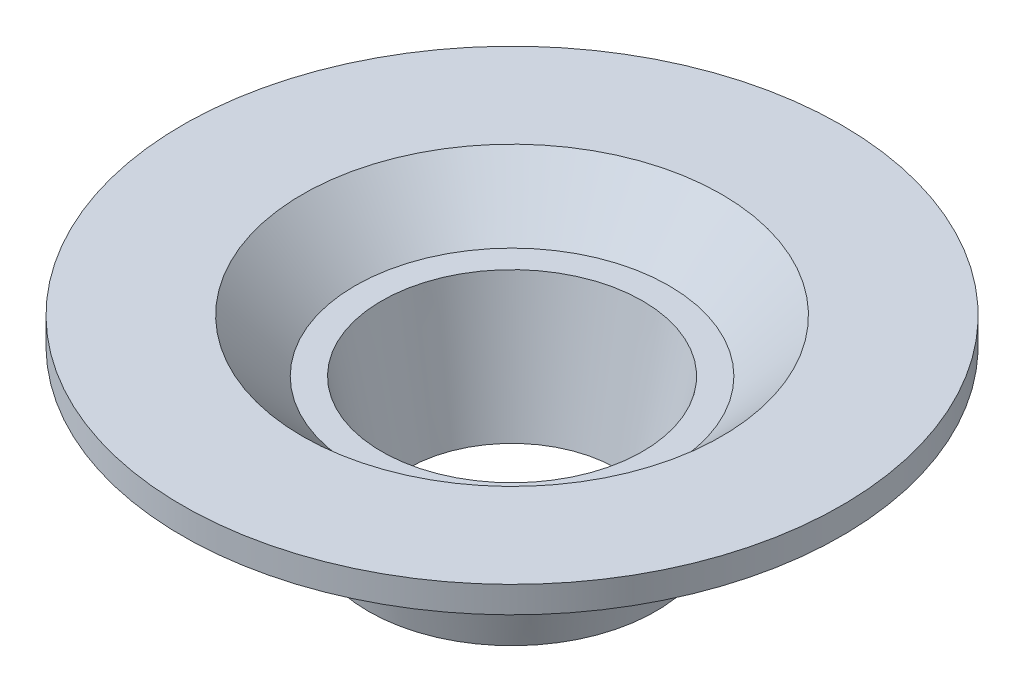
ISO-10303-21;
HEADER;
FILE_DESCRIPTION(('STEP AP214'),'2;1');
FILE_NAME('part.step','',(''),(''),'','','');
FILE_SCHEMA(('AUTOMOTIVE_DESIGN { 1 0 10303 214 1 1 1 1 }'));
ENDSEC;
DATA;
#1=APPLICATION_CONTEXT('core data for automotive mechanical design processes');
#2=APPLICATION_PROTOCOL_DEFINITION('international standard','automotive_design',2000,#1);
#3=PRODUCT_CONTEXT('',#1,'mechanical');
#4=PRODUCT('Part','Part','',(#3));
#5=PRODUCT_RELATED_PRODUCT_CATEGORY('part','',(#4));
#6=PRODUCT_DEFINITION_FORMATION('','',#4);
#7=PRODUCT_DEFINITION_CONTEXT('part definition',#1,'design');
#8=PRODUCT_DEFINITION('design','',#6,#7);
#9=PRODUCT_DEFINITION_SHAPE('','',#8);
#10=(LENGTH_UNIT() NAMED_UNIT(*) SI_UNIT(.MILLI.,.METRE.));
#11=(NAMED_UNIT(*) PLANE_ANGLE_UNIT() SI_UNIT($,.RADIAN.));
#12=(NAMED_UNIT(*) SI_UNIT($,.STERADIAN.) SOLID_ANGLE_UNIT());
#13=UNCERTAINTY_MEASURE_WITH_UNIT(LENGTH_MEASURE(1.E-05),#10,'distance_accuracy_value','');
#14=(GEOMETRIC_REPRESENTATION_CONTEXT(3) GLOBAL_UNCERTAINTY_ASSIGNED_CONTEXT((#13)) GLOBAL_UNIT_ASSIGNED_CONTEXT((#10,
#11,#12)) REPRESENTATION_CONTEXT('',''));
#15=CARTESIAN_POINT('',(0.,0.,0.));
#16=DIRECTION('',(0.,0.,1.));
#17=DIRECTION('',(1.,0.,0.));
#18=AXIS2_PLACEMENT_3D('',#15,#16,#17);
#19=CARTESIAN_POINT('',(0.,5.,0.));
#20=DIRECTION('',(0.,1.,0.));
#21=DIRECTION('',(0.,0.,1.));
#22=AXIS2_PLACEMENT_3D('',#19,#20,#21);
#23=CONICAL_SURFACE('',#22,4.95,0.197395559849881);
#24=CARTESIAN_POINT('',(0.,0.,0.));
#25=DIRECTION('',(0.,-1.,0.));
#26=DIRECTION('',(0.,0.,-1.));
#27=AXIS2_PLACEMENT_3D('',#24,#25,#26);
#28=CIRCLE('',#27,3.95);
#29=CARTESIAN_POINT('',(0.,0.,-3.95));
#30=VERTEX_POINT('',#29);
#31=EDGE_CURVE('E71',#30,#30,#28,.T.);
#32=ORIENTED_EDGE('',*,*,#31,.T.);
#33=EDGE_LOOP('',(#32));
#34=FACE_BOUND('',#33,.T.);
#35=CARTESIAN_POINT('',(0.,5.,0.));
#36=DIRECTION('',(0.,-1.,0.));
#37=DIRECTION('',(0.,0.,-1.));
#38=AXIS2_PLACEMENT_3D('',#35,#36,#37);
#39=CIRCLE('',#38,4.95);
#40=CARTESIAN_POINT('',(0.,5.,-4.95));
#41=VERTEX_POINT('',#40);
#42=EDGE_CURVE('E10',#41,#41,#39,.T.);
#43=ORIENTED_EDGE('',*,*,#42,.F.);
#44=EDGE_LOOP('',(#43));
#45=FACE_BOUND('',#44,.T.);
#46=ADVANCED_FACE('F40',(#34,#45),#23,.F.);
#47=CARTESIAN_POINT('',(4.95,5.,0.));
#48=DIRECTION('',(0.,1.,0.));
#49=DIRECTION('',(0.,0.,1.));
#50=AXIS2_PLACEMENT_3D('',#47,#48,#49);
#51=PLANE('',#50);
#52=ORIENTED_EDGE('',*,*,#42,.T.);
#53=EDGE_LOOP('',(#52));
#54=FACE_BOUND('',#53,.T.);
#55=CARTESIAN_POINT('',(0.,5.,0.));
#56=DIRECTION('',(0.,-1.,0.));
#57=DIRECTION('',(0.,0.,-1.));
#58=AXIS2_PLACEMENT_3D('',#55,#56,#57);
#59=CIRCLE('',#58,5.95);
#60=CARTESIAN_POINT('',(0.,5.,-5.95));
#61=VERTEX_POINT('',#60);
#62=EDGE_CURVE('E43',#61,#61,#59,.T.);
#63=ORIENTED_EDGE('',*,*,#62,.F.);
#64=EDGE_LOOP('',(#63));
#65=FACE_BOUND('',#64,.T.);
#66=ADVANCED_FACE('F87',(#54,#65),#51,.T.);
#67=CARTESIAN_POINT('',(0.,7.,0.));
#68=DIRECTION('',(0.,1.,0.));
#69=DIRECTION('',(0.,0.,1.));
#70=AXIS2_PLACEMENT_3D('',#67,#68,#69);
#71=CONICAL_SURFACE('',#70,7.95,0.785398163397448);
#72=ORIENTED_EDGE('',*,*,#62,.T.);
#73=EDGE_LOOP('',(#72));
#74=FACE_BOUND('',#73,.T.);
#75=CARTESIAN_POINT('',(0.,7.,0.));
#76=DIRECTION('',(0.,-1.,0.));
#77=DIRECTION('',(0.,0.,-1.));
#78=AXIS2_PLACEMENT_3D('',#75,#76,#77);
#79=CIRCLE('',#78,7.95);
#80=CARTESIAN_POINT('',(0.,7.,-7.95));
#81=VERTEX_POINT('',#80);
#82=EDGE_CURVE('E50',#81,#81,#79,.T.);
#83=ORIENTED_EDGE('',*,*,#82,.F.);
#84=EDGE_LOOP('',(#83));
#85=FACE_BOUND('',#84,.T.);
#86=ADVANCED_FACE('F93',(#74,#85),#71,.F.);
#87=CARTESIAN_POINT('',(7.95,7.,0.));
#88=DIRECTION('',(0.,1.,0.));
#89=DIRECTION('',(0.,0.,1.));
#90=AXIS2_PLACEMENT_3D('',#87,#88,#89);
#91=PLANE('',#90);
#92=ORIENTED_EDGE('',*,*,#82,.T.);
#93=EDGE_LOOP('',(#92));
#94=FACE_BOUND('',#93,.T.);
#95=CARTESIAN_POINT('',(0.,7.,0.));
#96=DIRECTION('',(0.,-1.,0.));
#97=DIRECTION('',(0.,0.,-1.));
#98=AXIS2_PLACEMENT_3D('',#95,#96,#97);
#99=CIRCLE('',#98,12.5);
#100=CARTESIAN_POINT('',(0.,7.,-12.5));
#101=VERTEX_POINT('',#100);
#102=EDGE_CURVE('E51',#101,#101,#99,.T.);
#103=ORIENTED_EDGE('',*,*,#102,.F.);
#104=EDGE_LOOP('',(#103));
#105=FACE_BOUND('',#104,.T.);
#106=ADVANCED_FACE('F100',(#94,#105),#91,.T.);
#107=CARTESIAN_POINT('',(0.,0.,0.));
#108=DIRECTION('',(0.,-1.,0.));
#109=DIRECTION('',(0.,0.,-1.));
#110=AXIS2_PLACEMENT_3D('',#107,#108,#109);
#111=CYLINDRICAL_SURFACE('',#110,12.5);
#112=ORIENTED_EDGE('',*,*,#102,.T.);
#113=EDGE_LOOP('',(#112));
#114=FACE_BOUND('',#113,.T.);
#115=CARTESIAN_POINT('',(0.,6.,0.));
#116=DIRECTION('',(0.,-1.,0.));
#117=DIRECTION('',(0.,0.,-1.));
#118=AXIS2_PLACEMENT_3D('',#115,#116,#117);
#119=CIRCLE('',#118,12.5);
#120=CARTESIAN_POINT('',(0.,6.,-12.5));
#121=VERTEX_POINT('',#120);
#122=EDGE_CURVE('E57',#121,#121,#119,.T.);
#123=ORIENTED_EDGE('',*,*,#122,.F.);
#124=EDGE_LOOP('',(#123));
#125=FACE_BOUND('',#124,.T.);
#126=ADVANCED_FACE('F104',(#114,#125),#111,.T.);
#127=CARTESIAN_POINT('',(12.5,6.,0.));
#128=DIRECTION('',(0.,-1.,0.));
#129=DIRECTION('',(0.,0.,-1.));
#130=AXIS2_PLACEMENT_3D('',#127,#128,#129);
#131=PLANE('',#130);
#132=ORIENTED_EDGE('',*,*,#122,.T.);
#133=EDGE_LOOP('',(#132));
#134=FACE_BOUND('',#133,.T.);
#135=CARTESIAN_POINT('',(0.,6.,0.));
#136=DIRECTION('',(0.,-1.,0.));
#137=DIRECTION('',(0.,0.,-1.));
#138=AXIS2_PLACEMENT_3D('',#135,#136,#137);
#139=CIRCLE('',#138,10.5);
#140=CARTESIAN_POINT('',(0.,6.,-10.5));
#141=VERTEX_POINT('',#140);
#142=EDGE_CURVE('E56',#141,#141,#139,.T.);
#143=ORIENTED_EDGE('',*,*,#142,.F.);
#144=EDGE_LOOP('',(#143));
#145=FACE_BOUND('',#144,.T.);
#146=ADVANCED_FACE('F107',(#134,#145),#131,.T.);
#147=CARTESIAN_POINT('',(0.,4.,0.));
#148=DIRECTION('',(0.,1.,0.));
#149=DIRECTION('',(0.,0.,1.));
#150=AXIS2_PLACEMENT_3D('',#147,#148,#149);
#151=CONICAL_SURFACE('',#150,8.5,0.785398163397447);
#152=ORIENTED_EDGE('',*,*,#142,.T.);
#153=EDGE_LOOP('',(#152));
#154=FACE_BOUND('',#153,.T.);
#155=CARTESIAN_POINT('',(0.,4.,0.));
#156=DIRECTION('',(0.,-1.,0.));
#157=DIRECTION('',(0.,0.,-1.));
#158=AXIS2_PLACEMENT_3D('',#155,#156,#157);
#159=CIRCLE('',#158,8.5);
#160=CARTESIAN_POINT('',(0.,4.,-8.5));
#161=VERTEX_POINT('',#160);
#162=EDGE_CURVE('E62',#161,#161,#159,.T.);
#163=ORIENTED_EDGE('',*,*,#162,.F.);
#164=EDGE_LOOP('',(#163));
#165=FACE_BOUND('',#164,.T.);
#166=ADVANCED_FACE('F112',(#154,#165),#151,.T.);
#167=CARTESIAN_POINT('',(8.5,4.,0.));
#168=DIRECTION('',(0.,-1.,0.));
#169=DIRECTION('',(0.,0.,-1.));
#170=AXIS2_PLACEMENT_3D('',#167,#168,#169);
#171=PLANE('',#170);
#172=ORIENTED_EDGE('',*,*,#162,.T.);
#173=EDGE_LOOP('',(#172));
#174=FACE_BOUND('',#173,.T.);
#175=CARTESIAN_POINT('',(0.,4.,0.));
#176=DIRECTION('',(0.,-1.,0.));
#177=DIRECTION('',(0.,0.,-1.));
#178=AXIS2_PLACEMENT_3D('',#175,#176,#177);
#179=CIRCLE('',#178,6.25);
#180=CARTESIAN_POINT('',(0.,4.,-6.25));
#181=VERTEX_POINT('',#180);
#182=EDGE_CURVE('E65',#181,#181,#179,.T.);
#183=ORIENTED_EDGE('',*,*,#182,.F.);
#184=EDGE_LOOP('',(#183));
#185=FACE_BOUND('',#184,.T.);
#186=ADVANCED_FACE('F82',(#174,#185),#171,.T.);
#187=CARTESIAN_POINT('',(0.,0.,0.));
#188=DIRECTION('',(0.,1.,0.));
#189=DIRECTION('',(0.,0.,1.));
#190=AXIS2_PLACEMENT_3D('',#187,#188,#189);
#191=CONICAL_SURFACE('',#190,5.45,0.197395559849881);
#192=ORIENTED_EDGE('',*,*,#182,.T.);
#193=EDGE_LOOP('',(#192));
#194=FACE_BOUND('',#193,.T.);
#195=CARTESIAN_POINT('',(0.,0.,0.));
#196=DIRECTION('',(0.,-1.,0.));
#197=DIRECTION('',(0.,0.,-1.));
#198=AXIS2_PLACEMENT_3D('',#195,#196,#197);
#199=CIRCLE('',#198,5.45);
#200=CARTESIAN_POINT('',(0.,0.,-5.45));
#201=VERTEX_POINT('',#200);
#202=EDGE_CURVE('E66',#201,#201,#199,.T.);
#203=ORIENTED_EDGE('',*,*,#202,.F.);
#204=EDGE_LOOP('',(#203));
#205=FACE_BOUND('',#204,.T.);
#206=ADVANCED_FACE('F80',(#194,#205),#191,.T.);
#207=CARTESIAN_POINT('',(5.45,0.,0.));
#208=DIRECTION('',(0.,-1.,0.));
#209=DIRECTION('',(0.,0.,-1.));
#210=AXIS2_PLACEMENT_3D('',#207,#208,#209);
#211=PLANE('',#210);
#212=ORIENTED_EDGE('',*,*,#202,.T.);
#213=EDGE_LOOP('',(#212));
#214=FACE_BOUND('',#213,.T.);
#215=ORIENTED_EDGE('',*,*,#31,.F.);
#216=EDGE_LOOP('',(#215));
#217=FACE_BOUND('',#216,.T.);
#218=ADVANCED_FACE('F77',(#214,#217),#211,.T.);
#219=CLOSED_SHELL('',(#46,#66,#86,#106,#126,#146,#166,#186,#206,#218));
#220=MANIFOLD_SOLID_BREP('B2',#219);
#221=ADVANCED_BREP_SHAPE_REPRESENTATION('',(#18,#220),#14);
#222=SHAPE_DEFINITION_REPRESENTATION(#9,#221);
ENDSEC;
END-ISO-10303-21;
